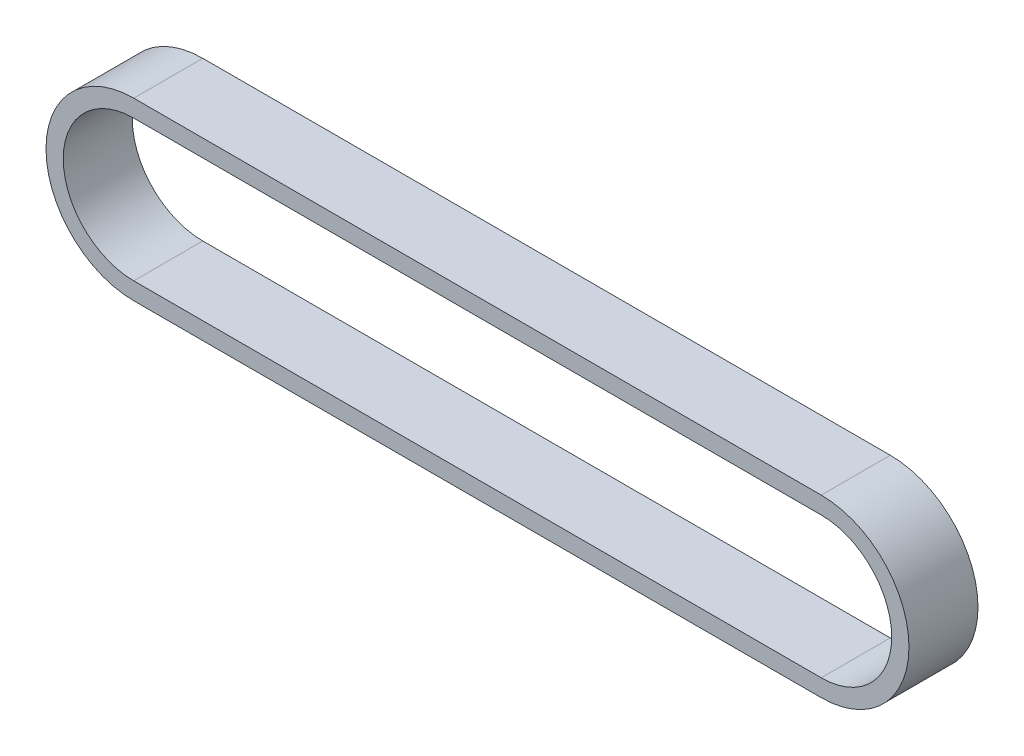
ISO-10303-21;
HEADER;
FILE_DESCRIPTION(('STEP AP214'),'2;1');
FILE_NAME('part.step','',(''),(''),'','','');
FILE_SCHEMA(('AUTOMOTIVE_DESIGN { 1 0 10303 214 1 1 1 1 }'));
ENDSEC;
DATA;
#1=APPLICATION_CONTEXT('core data for automotive mechanical design processes');
#2=APPLICATION_PROTOCOL_DEFINITION('international standard','automotive_design',2000,#1);
#3=PRODUCT_CONTEXT('',#1,'mechanical');
#4=PRODUCT('Part','Part','',(#3));
#5=PRODUCT_RELATED_PRODUCT_CATEGORY('part','',(#4));
#6=PRODUCT_DEFINITION_FORMATION('','',#4);
#7=PRODUCT_DEFINITION_CONTEXT('part definition',#1,'design');
#8=PRODUCT_DEFINITION('design','',#6,#7);
#9=PRODUCT_DEFINITION_SHAPE('','',#8);
#10=(LENGTH_UNIT() NAMED_UNIT(*) SI_UNIT(.MILLI.,.METRE.));
#11=(NAMED_UNIT(*) PLANE_ANGLE_UNIT() SI_UNIT($,.RADIAN.));
#12=(NAMED_UNIT(*) SI_UNIT($,.STERADIAN.) SOLID_ANGLE_UNIT());
#13=UNCERTAINTY_MEASURE_WITH_UNIT(LENGTH_MEASURE(1.E-05),#10,'distance_accuracy_value','');
#14=(GEOMETRIC_REPRESENTATION_CONTEXT(3) GLOBAL_UNCERTAINTY_ASSIGNED_CONTEXT((#13)) GLOBAL_UNIT_ASSIGNED_CONTEXT((#10,
#11,#12)) REPRESENTATION_CONTEXT('',''));
#15=CARTESIAN_POINT('',(0.,0.,0.));
#16=DIRECTION('',(0.,0.,1.));
#17=DIRECTION('',(1.,0.,0.));
#18=AXIS2_PLACEMENT_3D('',#15,#16,#17);
#19=CARTESIAN_POINT('',(0.,0.,6.));
#20=DIRECTION('',(0.,0.,1.));
#21=DIRECTION('',(1.,0.,0.));
#22=AXIS2_PLACEMENT_3D('',#19,#20,#21);
#23=PLANE('',#22);
#24=CARTESIAN_POINT('',(0.,0.,6.));
#25=DIRECTION('',(0.,0.,1.));
#26=DIRECTION('',(1.,0.,0.));
#27=AXIS2_PLACEMENT_3D('',#24,#25,#26);
#28=CIRCLE('',#27,7.62499999999999);
#29=CARTESIAN_POINT('',(0.,7.62499999999999,6.));
#30=VERTEX_POINT('',#29);
#31=CARTESIAN_POINT('',(0.,-7.62499999999999,6.));
#32=VERTEX_POINT('',#31);
#33=EDGE_CURVE('E135',#30,#32,#28,.T.);
#34=ORIENTED_EDGE('',*,*,#33,.T.);
#35=DIRECTION('',(1.,0.,0.));
#36=VECTOR('',#35,1.);
#37=CARTESIAN_POINT('',(0.,-7.62499999999999,6.));
#38=LINE('',#37,#36);
#39=CARTESIAN_POINT('',(59.75,-7.625,6.));
#40=VERTEX_POINT('',#39);
#41=EDGE_CURVE('E138',#32,#40,#38,.T.);
#42=ORIENTED_EDGE('',*,*,#41,.T.);
#43=CARTESIAN_POINT('',(59.75,0.,6.));
#44=DIRECTION('',(0.,0.,1.));
#45=DIRECTION('',(1.,0.,0.));
#46=AXIS2_PLACEMENT_3D('',#43,#44,#45);
#47=CIRCLE('',#46,7.625);
#48=CARTESIAN_POINT('',(59.75,7.625,6.));
#49=VERTEX_POINT('',#48);
#50=EDGE_CURVE('E141',#40,#49,#47,.T.);
#51=ORIENTED_EDGE('',*,*,#50,.T.);
#52=DIRECTION('',(-1.,0.,0.));
#53=VECTOR('',#52,1.);
#54=CARTESIAN_POINT('',(0.,7.62499999999999,6.));
#55=LINE('',#54,#53);
#56=EDGE_CURVE('E143',#49,#30,#55,.T.);
#57=ORIENTED_EDGE('',*,*,#56,.T.);
#58=EDGE_LOOP('',(#34,#42,#51,#57));
#59=FACE_BOUND('',#58,.T.);
#60=DIRECTION('',(1.,0.,0.));
#61=VECTOR('',#60,1.);
#62=CARTESIAN_POINT('',(0.,-6.125,6.));
#63=LINE('',#62,#61);
#64=CARTESIAN_POINT('',(0.,-6.125,6.));
#65=VERTEX_POINT('',#64);
#66=CARTESIAN_POINT('',(59.75,-6.125,6.));
#67=VERTEX_POINT('',#66);
#68=EDGE_CURVE('E107',#65,#67,#63,.T.);
#69=ORIENTED_EDGE('',*,*,#68,.F.);
#70=CARTESIAN_POINT('',(0.,0.,6.));
#71=DIRECTION('',(0.,0.,1.));
#72=DIRECTION('',(1.,0.,0.));
#73=AXIS2_PLACEMENT_3D('',#70,#71,#72);
#74=CIRCLE('',#73,6.125);
#75=CARTESIAN_POINT('',(0.,6.125,6.));
#76=VERTEX_POINT('',#75);
#77=EDGE_CURVE('E99',#76,#65,#74,.T.);
#78=ORIENTED_EDGE('',*,*,#77,.F.);
#79=DIRECTION('',(-1.,0.,0.));
#80=VECTOR('',#79,1.);
#81=CARTESIAN_POINT('',(0.,6.125,6.));
#82=LINE('',#81,#80);
#83=CARTESIAN_POINT('',(59.75,6.125,6.));
#84=VERTEX_POINT('',#83);
#85=EDGE_CURVE('E121',#84,#76,#82,.T.);
#86=ORIENTED_EDGE('',*,*,#85,.F.);
#87=CARTESIAN_POINT('',(59.75,0.,6.));
#88=DIRECTION('',(0.,0.,1.));
#89=DIRECTION('',(1.,0.,0.));
#90=AXIS2_PLACEMENT_3D('',#87,#88,#89);
#91=CIRCLE('',#90,6.125);
#92=EDGE_CURVE('E119',#67,#84,#91,.T.);
#93=ORIENTED_EDGE('',*,*,#92,.F.);
#94=EDGE_LOOP('',(#69,#78,#86,#93));
#95=FACE_BOUND('',#94,.T.);
#96=ADVANCED_FACE('F34',(#59,#95),#23,.T.);
#97=CARTESIAN_POINT('',(0.,0.,0.));
#98=DIRECTION('',(0.,0.,1.));
#99=DIRECTION('',(1.,0.,0.));
#100=AXIS2_PLACEMENT_3D('',#97,#98,#99);
#101=PLANE('',#100);
#102=CARTESIAN_POINT('',(0.,0.,0.));
#103=DIRECTION('',(0.,0.,1.));
#104=DIRECTION('',(1.,0.,0.));
#105=AXIS2_PLACEMENT_3D('',#102,#103,#104);
#106=CIRCLE('',#105,7.62499999999999);
#107=CARTESIAN_POINT('',(0.,7.62499999999999,0.));
#108=VERTEX_POINT('',#107);
#109=CARTESIAN_POINT('',(0.,-7.62499999999999,0.));
#110=VERTEX_POINT('',#109);
#111=EDGE_CURVE('E115',#108,#110,#106,.T.);
#112=ORIENTED_EDGE('',*,*,#111,.F.);
#113=DIRECTION('',(-1.,0.,0.));
#114=VECTOR('',#113,1.);
#115=CARTESIAN_POINT('',(0.,7.62499999999999,0.));
#116=LINE('',#115,#114);
#117=CARTESIAN_POINT('',(59.75,7.625,0.));
#118=VERTEX_POINT('',#117);
#119=EDGE_CURVE('E139',#118,#108,#116,.T.);
#120=ORIENTED_EDGE('',*,*,#119,.F.);
#121=CARTESIAN_POINT('',(59.75,0.,0.));
#122=DIRECTION('',(0.,0.,1.));
#123=DIRECTION('',(1.,0.,0.));
#124=AXIS2_PLACEMENT_3D('',#121,#122,#123);
#125=CIRCLE('',#124,7.625);
#126=CARTESIAN_POINT('',(59.75,-7.625,0.));
#127=VERTEX_POINT('',#126);
#128=EDGE_CURVE('E150',#127,#118,#125,.T.);
#129=ORIENTED_EDGE('',*,*,#128,.F.);
#130=DIRECTION('',(1.,0.,0.));
#131=VECTOR('',#130,1.);
#132=CARTESIAN_POINT('',(0.,-7.62499999999999,0.));
#133=LINE('',#132,#131);
#134=EDGE_CURVE('E148',#110,#127,#133,.T.);
#135=ORIENTED_EDGE('',*,*,#134,.F.);
#136=EDGE_LOOP('',(#112,#120,#129,#135));
#137=FACE_BOUND('',#136,.T.);
#138=CARTESIAN_POINT('',(0.,0.,0.));
#139=DIRECTION('',(0.,0.,1.));
#140=DIRECTION('',(1.,0.,0.));
#141=AXIS2_PLACEMENT_3D('',#138,#139,#140);
#142=CIRCLE('',#141,6.125);
#143=CARTESIAN_POINT('',(0.,6.125,0.));
#144=VERTEX_POINT('',#143);
#145=CARTESIAN_POINT('',(0.,-6.125,0.));
#146=VERTEX_POINT('',#145);
#147=EDGE_CURVE('E57',#144,#146,#142,.T.);
#148=ORIENTED_EDGE('',*,*,#147,.T.);
#149=DIRECTION('',(1.,0.,0.));
#150=VECTOR('',#149,1.);
#151=CARTESIAN_POINT('',(0.,-6.125,0.));
#152=LINE('',#151,#150);
#153=CARTESIAN_POINT('',(59.75,-6.125,0.));
#154=VERTEX_POINT('',#153);
#155=EDGE_CURVE('E114',#146,#154,#152,.T.);
#156=ORIENTED_EDGE('',*,*,#155,.T.);
#157=CARTESIAN_POINT('',(59.75,0.,0.));
#158=DIRECTION('',(0.,0.,1.));
#159=DIRECTION('',(1.,0.,0.));
#160=AXIS2_PLACEMENT_3D('',#157,#158,#159);
#161=CIRCLE('',#160,6.125);
#162=CARTESIAN_POINT('',(59.75,6.125,0.));
#163=VERTEX_POINT('',#162);
#164=EDGE_CURVE('E127',#154,#163,#161,.T.);
#165=ORIENTED_EDGE('',*,*,#164,.T.);
#166=DIRECTION('',(-1.,0.,0.));
#167=VECTOR('',#166,1.);
#168=CARTESIAN_POINT('',(0.,6.125,0.));
#169=LINE('',#168,#167);
#170=EDGE_CURVE('E108',#163,#144,#169,.T.);
#171=ORIENTED_EDGE('',*,*,#170,.T.);
#172=EDGE_LOOP('',(#148,#156,#165,#171));
#173=FACE_BOUND('',#172,.T.);
#174=ADVANCED_FACE('F168',(#137,#173),#101,.F.);
#175=CARTESIAN_POINT('',(0.,0.,6.));
#176=DIRECTION('',(0.,0.,-1.));
#177=DIRECTION('',(-1.,0.,0.));
#178=AXIS2_PLACEMENT_3D('',#175,#176,#177);
#179=CYLINDRICAL_SURFACE('',#178,7.62499999999999);
#180=ORIENTED_EDGE('',*,*,#111,.T.);
#181=DIRECTION('',(0.,0.,-1.));
#182=VECTOR('',#181,1.);
#183=CARTESIAN_POINT('',(0.,-7.62499999999999,6.));
#184=LINE('',#183,#182);
#185=EDGE_CURVE('E11',#32,#110,#184,.T.);
#186=ORIENTED_EDGE('',*,*,#185,.F.);
#187=ORIENTED_EDGE('',*,*,#33,.F.);
#188=DIRECTION('',(0.,0.,-1.));
#189=VECTOR('',#188,1.);
#190=CARTESIAN_POINT('',(0.,7.62499999999999,6.));
#191=LINE('',#190,#189);
#192=EDGE_CURVE('E145',#30,#108,#191,.T.);
#193=ORIENTED_EDGE('',*,*,#192,.T.);
#194=EDGE_LOOP('',(#180,#186,#187,#193));
#195=FACE_BOUND('',#194,.T.);
#196=ADVANCED_FACE('F36',(#195),#179,.T.);
#197=CARTESIAN_POINT('',(0.,-7.62499999999999,6.));
#198=DIRECTION('',(0.,1.,0.));
#199=DIRECTION('',(-1.,0.,0.));
#200=AXIS2_PLACEMENT_3D('',#197,#198,#199);
#201=PLANE('',#200);
#202=ORIENTED_EDGE('',*,*,#134,.T.);
#203=DIRECTION('',(0.,0.,-1.));
#204=VECTOR('',#203,1.);
#205=CARTESIAN_POINT('',(59.75,-7.625,6.));
#206=LINE('',#205,#204);
#207=EDGE_CURVE('E42',#40,#127,#206,.T.);
#208=ORIENTED_EDGE('',*,*,#207,.F.);
#209=ORIENTED_EDGE('',*,*,#41,.F.);
#210=ORIENTED_EDGE('',*,*,#185,.T.);
#211=EDGE_LOOP('',(#202,#208,#209,#210));
#212=FACE_BOUND('',#211,.T.);
#213=ADVANCED_FACE('F178',(#212),#201,.F.);
#214=CARTESIAN_POINT('',(59.75,0.,6.));
#215=DIRECTION('',(0.,0.,-1.));
#216=DIRECTION('',(-1.,0.,0.));
#217=AXIS2_PLACEMENT_3D('',#214,#215,#216);
#218=CYLINDRICAL_SURFACE('',#217,7.625);
#219=ORIENTED_EDGE('',*,*,#128,.T.);
#220=DIRECTION('',(0.,0.,-1.));
#221=VECTOR('',#220,1.);
#222=CARTESIAN_POINT('',(59.75,7.625,6.));
#223=LINE('',#222,#221);
#224=EDGE_CURVE('E155',#49,#118,#223,.T.);
#225=ORIENTED_EDGE('',*,*,#224,.F.);
#226=ORIENTED_EDGE('',*,*,#50,.F.);
#227=ORIENTED_EDGE('',*,*,#207,.T.);
#228=EDGE_LOOP('',(#219,#225,#226,#227));
#229=FACE_BOUND('',#228,.T.);
#230=ADVANCED_FACE('F162',(#229),#218,.T.);
#231=CARTESIAN_POINT('',(0.,7.62499999999999,6.));
#232=DIRECTION('',(0.,-1.,0.));
#233=DIRECTION('',(1.,0.,0.));
#234=AXIS2_PLACEMENT_3D('',#231,#232,#233);
#235=PLANE('',#234);
#236=ORIENTED_EDGE('',*,*,#119,.T.);
#237=ORIENTED_EDGE('',*,*,#192,.F.);
#238=ORIENTED_EDGE('',*,*,#56,.F.);
#239=ORIENTED_EDGE('',*,*,#224,.T.);
#240=EDGE_LOOP('',(#236,#237,#238,#239));
#241=FACE_BOUND('',#240,.T.);
#242=ADVANCED_FACE('F172',(#241),#235,.F.);
#243=CARTESIAN_POINT('',(0.,0.,6.));
#244=DIRECTION('',(0.,0.,-1.));
#245=DIRECTION('',(-1.,0.,0.));
#246=AXIS2_PLACEMENT_3D('',#243,#244,#245);
#247=CYLINDRICAL_SURFACE('',#246,6.125);
#248=ORIENTED_EDGE('',*,*,#147,.F.);
#249=DIRECTION('',(0.,0.,-1.));
#250=VECTOR('',#249,1.);
#251=CARTESIAN_POINT('',(0.,6.125,6.));
#252=LINE('',#251,#250);
#253=EDGE_CURVE('E103',#76,#144,#252,.T.);
#254=ORIENTED_EDGE('',*,*,#253,.F.);
#255=ORIENTED_EDGE('',*,*,#77,.T.);
#256=DIRECTION('',(0.,0.,-1.));
#257=VECTOR('',#256,1.);
#258=CARTESIAN_POINT('',(0.,-6.125,6.));
#259=LINE('',#258,#257);
#260=EDGE_CURVE('E102',#65,#146,#259,.T.);
#261=ORIENTED_EDGE('',*,*,#260,.T.);
#262=EDGE_LOOP('',(#248,#254,#255,#261));
#263=FACE_BOUND('',#262,.T.);
#264=ADVANCED_FACE('F101',(#263),#247,.F.);
#265=CARTESIAN_POINT('',(0.,-6.125,6.));
#266=DIRECTION('',(0.,1.,0.));
#267=DIRECTION('',(0.,0.,1.));
#268=AXIS2_PLACEMENT_3D('',#265,#266,#267);
#269=PLANE('',#268);
#270=ORIENTED_EDGE('',*,*,#155,.F.);
#271=ORIENTED_EDGE('',*,*,#260,.F.);
#272=ORIENTED_EDGE('',*,*,#68,.T.);
#273=DIRECTION('',(0.,0.,-1.));
#274=VECTOR('',#273,1.);
#275=CARTESIAN_POINT('',(59.75,-6.125,6.));
#276=LINE('',#275,#274);
#277=EDGE_CURVE('E116',#67,#154,#276,.T.);
#278=ORIENTED_EDGE('',*,*,#277,.T.);
#279=EDGE_LOOP('',(#270,#271,#272,#278));
#280=FACE_BOUND('',#279,.T.);
#281=ADVANCED_FACE('F111',(#280),#269,.T.);
#282=CARTESIAN_POINT('',(59.75,0.,6.));
#283=DIRECTION('',(0.,0.,-1.));
#284=DIRECTION('',(-1.,0.,0.));
#285=AXIS2_PLACEMENT_3D('',#282,#283,#284);
#286=CYLINDRICAL_SURFACE('',#285,6.125);
#287=ORIENTED_EDGE('',*,*,#164,.F.);
#288=ORIENTED_EDGE('',*,*,#277,.F.);
#289=ORIENTED_EDGE('',*,*,#92,.T.);
#290=DIRECTION('',(0.,0.,-1.));
#291=VECTOR('',#290,1.);
#292=CARTESIAN_POINT('',(59.75,6.125,6.));
#293=LINE('',#292,#291);
#294=EDGE_CURVE('E49',#84,#163,#293,.T.);
#295=ORIENTED_EDGE('',*,*,#294,.T.);
#296=EDGE_LOOP('',(#287,#288,#289,#295));
#297=FACE_BOUND('',#296,.T.);
#298=ADVANCED_FACE('F201',(#297),#286,.F.);
#299=CARTESIAN_POINT('',(0.,6.125,6.));
#300=DIRECTION('',(0.,-1.,0.));
#301=DIRECTION('',(0.,0.,-1.));
#302=AXIS2_PLACEMENT_3D('',#299,#300,#301);
#303=PLANE('',#302);
#304=ORIENTED_EDGE('',*,*,#170,.F.);
#305=ORIENTED_EDGE('',*,*,#294,.F.);
#306=ORIENTED_EDGE('',*,*,#85,.T.);
#307=ORIENTED_EDGE('',*,*,#253,.T.);
#308=EDGE_LOOP('',(#304,#305,#306,#307));
#309=FACE_BOUND('',#308,.T.);
#310=ADVANCED_FACE('F205',(#309),#303,.T.);
#311=CLOSED_SHELL('',(#96,#174,#196,#213,#230,#242,#264,#281,#298,#310));
#312=MANIFOLD_SOLID_BREP('B2',#311);
#313=ADVANCED_BREP_SHAPE_REPRESENTATION('',(#18,#312),#14);
#314=SHAPE_DEFINITION_REPRESENTATION(#9,#313);
ENDSEC;
END-ISO-10303-21;
